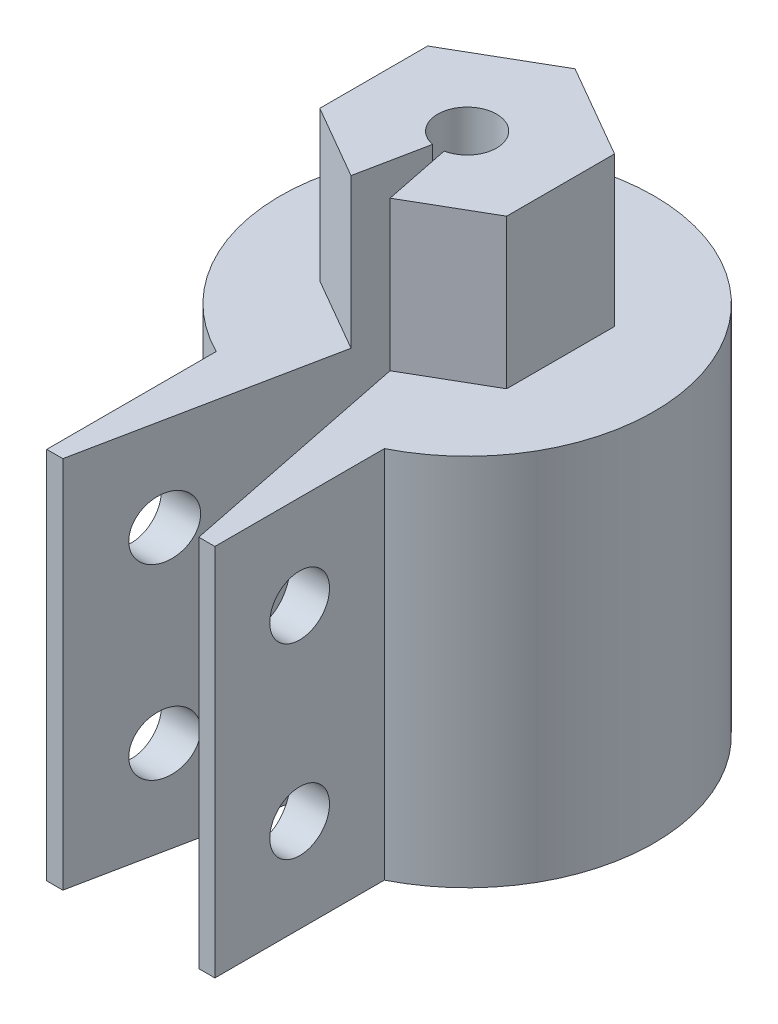
ISO-10303-21;
HEADER;
FILE_DESCRIPTION(('STEP AP214'),'2;1');
FILE_NAME('part.step','',(''),(''),'','','');
FILE_SCHEMA(('AUTOMOTIVE_DESIGN { 1 0 10303 214 1 1 1 1 }'));
ENDSEC;
DATA;
#1=APPLICATION_CONTEXT('core data for automotive mechanical design processes');
#2=APPLICATION_PROTOCOL_DEFINITION('international standard','automotive_design',2000,#1);
#3=PRODUCT_CONTEXT('',#1,'mechanical');
#4=PRODUCT('Part','Part','',(#3));
#5=PRODUCT_RELATED_PRODUCT_CATEGORY('part','',(#4));
#6=PRODUCT_DEFINITION_FORMATION('','',#4);
#7=PRODUCT_DEFINITION_CONTEXT('part definition',#1,'design');
#8=PRODUCT_DEFINITION('design','',#6,#7);
#9=PRODUCT_DEFINITION_SHAPE('','',#8);
#10=(LENGTH_UNIT() NAMED_UNIT(*) SI_UNIT(.MILLI.,.METRE.));
#11=(NAMED_UNIT(*) PLANE_ANGLE_UNIT() SI_UNIT($,.RADIAN.));
#12=(NAMED_UNIT(*) SI_UNIT($,.STERADIAN.) SOLID_ANGLE_UNIT());
#13=UNCERTAINTY_MEASURE_WITH_UNIT(LENGTH_MEASURE(1.E-05),#10,'distance_accuracy_value','');
#14=(GEOMETRIC_REPRESENTATION_CONTEXT(3) GLOBAL_UNCERTAINTY_ASSIGNED_CONTEXT((#13)) GLOBAL_UNIT_ASSIGNED_CONTEXT((#10,
#11,#12)) REPRESENTATION_CONTEXT('',''));
#15=CARTESIAN_POINT('',(0.,0.,0.));
#16=DIRECTION('',(0.,0.,1.));
#17=DIRECTION('',(1.,0.,0.));
#18=AXIS2_PLACEMENT_3D('',#15,#16,#17);
#19=CARTESIAN_POINT('',(-4.5,20.,18.));
#20=DIRECTION('',(0.,0.,-1.));
#21=DIRECTION('',(-1.,0.,0.));
#22=AXIS2_PLACEMENT_3D('',#19,#20,#21);
#23=PLANE('',#22);
#24=DIRECTION('',(1.,0.,0.));
#25=VECTOR('',#24,1.);
#26=CARTESIAN_POINT('',(-4.5,0.,18.));
#27=LINE('',#26,#25);
#28=CARTESIAN_POINT('',(-4.5,0.,18.));
#29=VERTEX_POINT('',#28);
#30=CARTESIAN_POINT('',(-3.63877850256524,0.,18.));
#31=VERTEX_POINT('',#30);
#32=EDGE_CURVE('E169',#29,#31,#27,.T.);
#33=ORIENTED_EDGE('',*,*,#32,.T.);
#34=DIRECTION('',(0.,1.,0.));
#35=VECTOR('',#34,1.);
#36=CARTESIAN_POINT('',(-3.63877850256524,0.,18.));
#37=LINE('',#36,#35);
#38=CARTESIAN_POINT('',(-3.63877850256524,20.,18.));
#39=VERTEX_POINT('',#38);
#40=EDGE_CURVE('E221',#31,#39,#37,.T.);
#41=ORIENTED_EDGE('',*,*,#40,.T.);
#42=DIRECTION('',(1.,0.,0.));
#43=VECTOR('',#42,1.);
#44=CARTESIAN_POINT('',(-4.5,20.,18.));
#45=LINE('',#44,#43);
#46=CARTESIAN_POINT('',(-4.5,20.,18.));
#47=VERTEX_POINT('',#46);
#48=EDGE_CURVE('E282',#47,#39,#45,.T.);
#49=ORIENTED_EDGE('',*,*,#48,.F.);
#50=DIRECTION('',(0.,-1.,0.));
#51=VECTOR('',#50,1.);
#52=CARTESIAN_POINT('',(-4.5,20.,18.));
#53=LINE('',#52,#51);
#54=EDGE_CURVE('E185',#47,#29,#53,.T.);
#55=ORIENTED_EDGE('',*,*,#54,.T.);
#56=EDGE_LOOP('',(#33,#41,#49,#55));
#57=FACE_BOUND('',#56,.T.);
#58=ADVANCED_FACE('F35',(#57),#23,.F.);
#59=CARTESIAN_POINT('',(0.,20.,0.));
#60=DIRECTION('',(0.,-1.,0.));
#61=DIRECTION('',(0.,0.,-1.));
#62=AXIS2_PLACEMENT_3D('',#59,#60,#61);
#63=CYLINDRICAL_SURFACE('',#62,10.);
#64=CARTESIAN_POINT('',(0.,0.,0.));
#65=DIRECTION('',(0.,1.,0.));
#66=DIRECTION('',(0.,0.,1.));
#67=AXIS2_PLACEMENT_3D('',#64,#65,#66);
#68=CIRCLE('',#67,10.);
#69=CARTESIAN_POINT('',(4.5,0.,8.93028554974588));
#70=VERTEX_POINT('',#69);
#71=CARTESIAN_POINT('',(-4.5,0.,8.93028554974588));
#72=VERTEX_POINT('',#71);
#73=EDGE_CURVE('E173',#70,#72,#68,.T.);
#74=ORIENTED_EDGE('',*,*,#73,.T.);
#75=DIRECTION('',(0.,-1.,0.));
#76=VECTOR('',#75,1.);
#77=CARTESIAN_POINT('',(-4.5,20.,8.93028554974588));
#78=LINE('',#77,#76);
#79=CARTESIAN_POINT('',(-4.5,20.,8.93028554974588));
#80=VERTEX_POINT('',#79);
#81=EDGE_CURVE('E44',#80,#72,#78,.T.);
#82=ORIENTED_EDGE('',*,*,#81,.F.);
#83=CARTESIAN_POINT('',(0.,20.,0.));
#84=DIRECTION('',(0.,1.,0.));
#85=DIRECTION('',(0.,0.,1.));
#86=AXIS2_PLACEMENT_3D('',#83,#84,#85);
#87=CIRCLE('',#86,10.);
#88=CARTESIAN_POINT('',(4.5,20.,8.93028554974588));
#89=VERTEX_POINT('',#88);
#90=EDGE_CURVE('E178',#89,#80,#87,.T.);
#91=ORIENTED_EDGE('',*,*,#90,.F.);
#92=DIRECTION('',(0.,-1.,0.));
#93=VECTOR('',#92,1.);
#94=CARTESIAN_POINT('',(4.5,20.,8.93028554974588));
#95=LINE('',#94,#93);
#96=EDGE_CURVE('E179',#89,#70,#95,.T.);
#97=ORIENTED_EDGE('',*,*,#96,.T.);
#98=EDGE_LOOP('',(#74,#82,#91,#97));
#99=FACE_BOUND('',#98,.T.);
#100=ADVANCED_FACE('F37',(#99),#63,.T.);
#101=CARTESIAN_POINT('',(-4.5,20.,8.93028554974588));
#102=DIRECTION('',(1.,0.,0.));
#103=DIRECTION('',(0.,0.,-1.));
#104=AXIS2_PLACEMENT_3D('',#101,#102,#103);
#105=PLANE('',#104);
#106=CARTESIAN_POINT('',(-4.5,15.,13.4651427748729));
#107=DIRECTION('',(-1.,0.,0.));
#108=DIRECTION('',(0.,0.,1.));
#109=AXIS2_PLACEMENT_3D('',#106,#107,#108);
#110=CIRCLE('',#109,1.6);
#111=CARTESIAN_POINT('',(-4.5,15.,15.0651427748729));
#112=VERTEX_POINT('',#111);
#113=EDGE_CURVE('E192',#112,#112,#110,.T.);
#114=ORIENTED_EDGE('',*,*,#113,.F.);
#115=EDGE_LOOP('',(#114));
#116=FACE_BOUND('',#115,.T.);
#117=CARTESIAN_POINT('',(-4.5,5.,13.4651427748729));
#118=DIRECTION('',(-1.,0.,0.));
#119=DIRECTION('',(0.,0.,1.));
#120=AXIS2_PLACEMENT_3D('',#117,#118,#119);
#121=CIRCLE('',#120,1.6);
#122=CARTESIAN_POINT('',(-4.5,5.,15.0651427748729));
#123=VERTEX_POINT('',#122);
#124=EDGE_CURVE('E199',#123,#123,#121,.T.);
#125=ORIENTED_EDGE('',*,*,#124,.F.);
#126=EDGE_LOOP('',(#125));
#127=FACE_BOUND('',#126,.T.);
#128=DIRECTION('',(0.,0.,1.));
#129=VECTOR('',#128,1.);
#130=CARTESIAN_POINT('',(-4.5,0.,8.93028554974588));
#131=LINE('',#130,#129);
#132=EDGE_CURVE('E170',#72,#29,#131,.T.);
#133=ORIENTED_EDGE('',*,*,#132,.T.);
#134=ORIENTED_EDGE('',*,*,#54,.F.);
#135=DIRECTION('',(0.,0.,1.));
#136=VECTOR('',#135,1.);
#137=CARTESIAN_POINT('',(-4.5,20.,8.93028554974588));
#138=LINE('',#137,#136);
#139=EDGE_CURVE('E280',#80,#47,#138,.T.);
#140=ORIENTED_EDGE('',*,*,#139,.F.);
#141=ORIENTED_EDGE('',*,*,#81,.T.);
#142=EDGE_LOOP('',(#133,#134,#140,#141));
#143=FACE_BOUND('',#142,.T.);
#144=ADVANCED_FACE('F293',(#116,#127,#143),#105,.F.);
#145=CARTESIAN_POINT('',(3.63877850256524,20.,18.));
#146=VERTEX_POINT('',#145);
#147=CARTESIAN_POINT('',(4.5,20.,18.));
#148=VERTEX_POINT('',#147);
#149=EDGE_CURVE('E162',#146,#148,#45,.T.);
#150=ORIENTED_EDGE('',*,*,#149,.F.);
#151=DIRECTION('',(0.,1.,0.));
#152=VECTOR('',#151,1.);
#153=CARTESIAN_POINT('',(3.63877850256524,0.,18.));
#154=LINE('',#153,#152);
#155=CARTESIAN_POINT('',(3.63877850256524,0.,18.));
#156=VERTEX_POINT('',#155);
#157=EDGE_CURVE('E145',#156,#146,#154,.T.);
#158=ORIENTED_EDGE('',*,*,#157,.F.);
#159=CARTESIAN_POINT('',(4.5,0.,18.));
#160=VERTEX_POINT('',#159);
#161=EDGE_CURVE('E160',#156,#160,#27,.T.);
#162=ORIENTED_EDGE('',*,*,#161,.T.);
#163=DIRECTION('',(0.,-1.,0.));
#164=VECTOR('',#163,1.);
#165=CARTESIAN_POINT('',(4.5,20.,18.));
#166=LINE('',#165,#164);
#167=EDGE_CURVE('E182',#148,#160,#166,.T.);
#168=ORIENTED_EDGE('',*,*,#167,.F.);
#169=EDGE_LOOP('',(#150,#158,#162,#168));
#170=FACE_BOUND('',#169,.T.);
#171=ADVANCED_FACE('F158',(#170),#23,.F.);
#172=CARTESIAN_POINT('',(4.5,20.,8.93028554974588));
#173=DIRECTION('',(-1.,0.,0.));
#174=DIRECTION('',(0.,0.,1.));
#175=AXIS2_PLACEMENT_3D('',#172,#173,#174);
#176=PLANE('',#175);
#177=CARTESIAN_POINT('',(4.5,15.,13.4651427748729));
#178=DIRECTION('',(-1.,0.,0.));
#179=DIRECTION('',(0.,0.,1.));
#180=AXIS2_PLACEMENT_3D('',#177,#178,#179);
#181=CIRCLE('',#180,1.6);
#182=CARTESIAN_POINT('',(4.5,15.,15.0651427748729));
#183=VERTEX_POINT('',#182);
#184=EDGE_CURVE('E211',#183,#183,#181,.T.);
#185=ORIENTED_EDGE('',*,*,#184,.T.);
#186=EDGE_LOOP('',(#185));
#187=FACE_BOUND('',#186,.T.);
#188=CARTESIAN_POINT('',(4.5,5.,13.4651427748729));
#189=DIRECTION('',(-1.,0.,0.));
#190=DIRECTION('',(0.,0.,1.));
#191=AXIS2_PLACEMENT_3D('',#188,#189,#190);
#192=CIRCLE('',#191,1.6);
#193=CARTESIAN_POINT('',(4.5,5.,15.0651427748729));
#194=VERTEX_POINT('',#193);
#195=EDGE_CURVE('E196',#194,#194,#192,.T.);
#196=ORIENTED_EDGE('',*,*,#195,.T.);
#197=EDGE_LOOP('',(#196));
#198=FACE_BOUND('',#197,.T.);
#199=DIRECTION('',(0.,0.,-1.));
#200=VECTOR('',#199,1.);
#201=CARTESIAN_POINT('',(4.5,0.,8.93028554974588));
#202=LINE('',#201,#200);
#203=EDGE_CURVE('E168',#160,#70,#202,.T.);
#204=ORIENTED_EDGE('',*,*,#203,.T.);
#205=ORIENTED_EDGE('',*,*,#96,.F.);
#206=DIRECTION('',(0.,0.,-1.));
#207=VECTOR('',#206,1.);
#208=CARTESIAN_POINT('',(4.5,20.,8.93028554974588));
#209=LINE('',#208,#207);
#210=EDGE_CURVE('E183',#148,#89,#209,.T.);
#211=ORIENTED_EDGE('',*,*,#210,.F.);
#212=ORIENTED_EDGE('',*,*,#167,.T.);
#213=EDGE_LOOP('',(#204,#205,#211,#212));
#214=FACE_BOUND('',#213,.T.);
#215=ADVANCED_FACE('F299',(#187,#198,#214),#176,.F.);
#216=CARTESIAN_POINT('',(0.,20.,0.));
#217=DIRECTION('',(0.,1.,0.));
#218=DIRECTION('',(0.,0.,1.));
#219=AXIS2_PLACEMENT_3D('',#216,#217,#218);
#220=PLANE('',#219);
#221=DIRECTION('',(-0.198146143199398,0.,0.980172487848544));
#222=VECTOR('',#221,1.);
#223=CARTESIAN_POINT('',(0.,20.,0.));
#224=LINE('',#223,#222);
#225=CARTESIAN_POINT('',(-1.04515469461128,20.,5.17008234761764));
#226=VERTEX_POINT('',#225);
#227=EDGE_CURVE('E233',#226,#39,#224,.T.);
#228=ORIENTED_EDGE('',*,*,#227,.F.);
#229=DIRECTION('',(0.866025403784438,0.,0.5));
#230=VECTOR('',#229,1.);
#231=CARTESIAN_POINT('',(-5.,20.,2.88675134594813));
#232=LINE('',#231,#230);
#233=CARTESIAN_POINT('',(-5.,20.,2.88675134594813));
#234=VERTEX_POINT('',#233);
#235=EDGE_CURVE('E258',#234,#226,#232,.T.);
#236=ORIENTED_EDGE('',*,*,#235,.F.);
#237=DIRECTION('',(0.,0.,1.));
#238=VECTOR('',#237,1.);
#239=CARTESIAN_POINT('',(-5.,20.,-2.88675134594813));
#240=LINE('',#239,#238);
#241=CARTESIAN_POINT('',(-5.,20.,-2.88675134594813));
#242=VERTEX_POINT('',#241);
#243=EDGE_CURVE('E255',#242,#234,#240,.T.);
#244=ORIENTED_EDGE('',*,*,#243,.F.);
#245=DIRECTION('',(-0.866025403784439,0.,0.5));
#246=VECTOR('',#245,1.);
#247=CARTESIAN_POINT('',(0.,20.,-5.77350269189626));
#248=LINE('',#247,#246);
#249=CARTESIAN_POINT('',(0.,20.,-5.77350269189626));
#250=VERTEX_POINT('',#249);
#251=EDGE_CURVE('E252',#250,#242,#248,.T.);
#252=ORIENTED_EDGE('',*,*,#251,.F.);
#253=DIRECTION('',(-0.866025403784439,0.,-0.5));
#254=VECTOR('',#253,1.);
#255=CARTESIAN_POINT('',(5.,20.,-2.88675134594813));
#256=LINE('',#255,#254);
#257=CARTESIAN_POINT('',(5.,20.,-2.88675134594813));
#258=VERTEX_POINT('',#257);
#259=EDGE_CURVE('E59',#258,#250,#256,.T.);
#260=ORIENTED_EDGE('',*,*,#259,.F.);
#261=DIRECTION('',(0.,0.,-1.));
#262=VECTOR('',#261,1.);
#263=CARTESIAN_POINT('',(5.,20.,2.88675134594813));
#264=LINE('',#263,#262);
#265=CARTESIAN_POINT('',(5.,20.,2.88675134594813));
#266=VERTEX_POINT('',#265);
#267=EDGE_CURVE('E239',#266,#258,#264,.T.);
#268=ORIENTED_EDGE('',*,*,#267,.F.);
#269=DIRECTION('',(0.866025403784439,0.,-0.5));
#270=VECTOR('',#269,1.);
#271=CARTESIAN_POINT('',(0.,20.,5.77350269189626));
#272=LINE('',#271,#270);
#273=CARTESIAN_POINT('',(1.04515469461128,20.,5.17008234761763));
#274=VERTEX_POINT('',#273);
#275=EDGE_CURVE('E261',#274,#266,#272,.T.);
#276=ORIENTED_EDGE('',*,*,#275,.F.);
#277=DIRECTION('',(-0.198146143199398,0.,-0.980172487848544));
#278=VECTOR('',#277,1.);
#279=CARTESIAN_POINT('',(0.,20.,0.));
#280=LINE('',#279,#278);
#281=EDGE_CURVE('E228',#146,#274,#280,.T.);
#282=ORIENTED_EDGE('',*,*,#281,.F.);
#283=ORIENTED_EDGE('',*,*,#149,.T.);
#284=ORIENTED_EDGE('',*,*,#210,.T.);
#285=ORIENTED_EDGE('',*,*,#90,.T.);
#286=ORIENTED_EDGE('',*,*,#139,.T.);
#287=ORIENTED_EDGE('',*,*,#48,.T.);
#288=EDGE_LOOP('',(#228,#236,#244,#252,#260,#268,#276,#282,#283,#284,#285,#286,#287));
#289=FACE_BOUND('',#288,.T.);
#290=ADVANCED_FACE('F296',(#289),#220,.T.);
#291=CARTESIAN_POINT('',(0.,0.,0.));
#292=DIRECTION('',(0.,1.,0.));
#293=DIRECTION('',(0.,0.,1.));
#294=AXIS2_PLACEMENT_3D('',#291,#292,#293);
#295=PLANE('',#294);
#296=CARTESIAN_POINT('',(0.,0.,0.));
#297=DIRECTION('',(0.,1.,0.));
#298=DIRECTION('',(0.,0.,1.));
#299=AXIS2_PLACEMENT_3D('',#296,#297,#298);
#300=CIRCLE('',#299,1.575);
#301=CARTESIAN_POINT('',(0.312080175539051,0.,1.54377166836146));
#302=VERTEX_POINT('',#301);
#303=CARTESIAN_POINT('',(-0.312080175539051,0.,1.54377166836146));
#304=VERTEX_POINT('',#303);
#305=EDGE_CURVE('E153',#302,#304,#300,.T.);
#306=ORIENTED_EDGE('',*,*,#305,.T.);
#307=DIRECTION('',(-0.198146143199398,0.,0.980172487848544));
#308=VECTOR('',#307,1.);
#309=CARTESIAN_POINT('',(-3.63877850256524,0.,18.));
#310=LINE('',#309,#308);
#311=EDGE_CURVE('E163',#304,#31,#310,.T.);
#312=ORIENTED_EDGE('',*,*,#311,.T.);
#313=ORIENTED_EDGE('',*,*,#32,.F.);
#314=ORIENTED_EDGE('',*,*,#132,.F.);
#315=ORIENTED_EDGE('',*,*,#73,.F.);
#316=ORIENTED_EDGE('',*,*,#203,.F.);
#317=ORIENTED_EDGE('',*,*,#161,.F.);
#318=DIRECTION('',(-0.198146143199398,0.,-0.980172487848544));
#319=VECTOR('',#318,1.);
#320=CARTESIAN_POINT('',(0.312080175539051,0.,1.54377166836146));
#321=LINE('',#320,#319);
#322=EDGE_CURVE('E142',#156,#302,#321,.T.);
#323=ORIENTED_EDGE('',*,*,#322,.T.);
#324=EDGE_LOOP('',(#306,#312,#313,#314,#315,#316,#317,#323));
#325=FACE_BOUND('',#324,.T.);
#326=ADVANCED_FACE('F166',(#325),#295,.F.);
#327=CARTESIAN_POINT('',(5.,28.,-2.88675134594813));
#328=DIRECTION('',(-0.5,0.,0.866025403784439));
#329=DIRECTION('',(0.866025403784439,0.,0.5));
#330=AXIS2_PLACEMENT_3D('',#327,#328,#329);
#331=PLANE('',#330);
#332=ORIENTED_EDGE('',*,*,#259,.T.);
#333=DIRECTION('',(0.,-1.,0.));
#334=VECTOR('',#333,1.);
#335=CARTESIAN_POINT('',(0.,28.,-5.77350269189626));
#336=LINE('',#335,#334);
#337=CARTESIAN_POINT('',(0.,28.,-5.77350269189626));
#338=VERTEX_POINT('',#337);
#339=EDGE_CURVE('E275',#338,#250,#336,.T.);
#340=ORIENTED_EDGE('',*,*,#339,.F.);
#341=DIRECTION('',(-0.866025403784439,0.,-0.5));
#342=VECTOR('',#341,1.);
#343=CARTESIAN_POINT('',(5.,28.,-2.88675134594813));
#344=LINE('',#343,#342);
#345=CARTESIAN_POINT('',(5.,28.,-2.88675134594813));
#346=VERTEX_POINT('',#345);
#347=EDGE_CURVE('E235',#346,#338,#344,.T.);
#348=ORIENTED_EDGE('',*,*,#347,.F.);
#349=DIRECTION('',(0.,-1.,0.));
#350=VECTOR('',#349,1.);
#351=CARTESIAN_POINT('',(5.,28.,-2.88675134594813));
#352=LINE('',#351,#350);
#353=EDGE_CURVE('E250',#346,#258,#352,.T.);
#354=ORIENTED_EDGE('',*,*,#353,.T.);
#355=EDGE_LOOP('',(#332,#340,#348,#354));
#356=FACE_BOUND('',#355,.T.);
#357=ADVANCED_FACE('F353',(#356),#331,.F.);
#358=CARTESIAN_POINT('',(0.,28.,-5.77350269189626));
#359=DIRECTION('',(0.5,0.,0.866025403784439));
#360=DIRECTION('',(0.866025403784439,0.,-0.5));
#361=AXIS2_PLACEMENT_3D('',#358,#359,#360);
#362=PLANE('',#361);
#363=ORIENTED_EDGE('',*,*,#251,.T.);
#364=DIRECTION('',(0.,-1.,0.));
#365=VECTOR('',#364,1.);
#366=CARTESIAN_POINT('',(-5.,28.,-2.88675134594813));
#367=LINE('',#366,#365);
#368=CARTESIAN_POINT('',(-5.,28.,-2.88675134594813));
#369=VERTEX_POINT('',#368);
#370=EDGE_CURVE('E272',#369,#242,#367,.T.);
#371=ORIENTED_EDGE('',*,*,#370,.F.);
#372=DIRECTION('',(-0.866025403784439,0.,0.5));
#373=VECTOR('',#372,1.);
#374=CARTESIAN_POINT('',(0.,28.,-5.77350269189626));
#375=LINE('',#374,#373);
#376=EDGE_CURVE('E238',#338,#369,#375,.T.);
#377=ORIENTED_EDGE('',*,*,#376,.F.);
#378=ORIENTED_EDGE('',*,*,#339,.T.);
#379=EDGE_LOOP('',(#363,#371,#377,#378));
#380=FACE_BOUND('',#379,.T.);
#381=ADVANCED_FACE('F349',(#380),#362,.F.);
#382=CARTESIAN_POINT('',(-5.,28.,-2.88675134594813));
#383=DIRECTION('',(1.,0.,0.));
#384=DIRECTION('',(0.,0.,-1.));
#385=AXIS2_PLACEMENT_3D('',#382,#383,#384);
#386=PLANE('',#385);
#387=ORIENTED_EDGE('',*,*,#243,.T.);
#388=DIRECTION('',(0.,-1.,0.));
#389=VECTOR('',#388,1.);
#390=CARTESIAN_POINT('',(-5.,28.,2.88675134594813));
#391=LINE('',#390,#389);
#392=CARTESIAN_POINT('',(-5.,28.,2.88675134594813));
#393=VERTEX_POINT('',#392);
#394=EDGE_CURVE('E269',#393,#234,#391,.T.);
#395=ORIENTED_EDGE('',*,*,#394,.F.);
#396=DIRECTION('',(0.,0.,1.));
#397=VECTOR('',#396,1.);
#398=CARTESIAN_POINT('',(-5.,28.,-2.88675134594813));
#399=LINE('',#398,#397);
#400=EDGE_CURVE('E241',#369,#393,#399,.T.);
#401=ORIENTED_EDGE('',*,*,#400,.F.);
#402=ORIENTED_EDGE('',*,*,#370,.T.);
#403=EDGE_LOOP('',(#387,#395,#401,#402));
#404=FACE_BOUND('',#403,.T.);
#405=ADVANCED_FACE('F346',(#404),#386,.F.);
#406=CARTESIAN_POINT('',(-5.,28.,2.88675134594813));
#407=DIRECTION('',(0.5,0.,-0.866025403784438));
#408=DIRECTION('',(-0.866025403784438,0.,-0.5));
#409=AXIS2_PLACEMENT_3D('',#406,#407,#408);
#410=PLANE('',#409);
#411=ORIENTED_EDGE('',*,*,#235,.T.);
#412=DIRECTION('',(0.,1.,0.));
#413=VECTOR('',#412,1.);
#414=CARTESIAN_POINT('',(-1.04515469461128,28.,5.17008234761764));
#415=LINE('',#414,#413);
#416=CARTESIAN_POINT('',(-1.04515469461128,28.,5.17008234761763));
#417=VERTEX_POINT('',#416);
#418=EDGE_CURVE('E230',#226,#417,#415,.T.);
#419=ORIENTED_EDGE('',*,*,#418,.T.);
#420=DIRECTION('',(0.866025403784438,0.,0.5));
#421=VECTOR('',#420,1.);
#422=CARTESIAN_POINT('',(-5.,28.,2.88675134594813));
#423=LINE('',#422,#421);
#424=EDGE_CURVE('E243',#393,#417,#423,.T.);
#425=ORIENTED_EDGE('',*,*,#424,.F.);
#426=ORIENTED_EDGE('',*,*,#394,.T.);
#427=EDGE_LOOP('',(#411,#419,#425,#426));
#428=FACE_BOUND('',#427,.T.);
#429=ADVANCED_FACE('F341',(#428),#410,.F.);
#430=CARTESIAN_POINT('',(0.,28.,5.77350269189626));
#431=DIRECTION('',(-0.5,0.,-0.866025403784439));
#432=DIRECTION('',(-0.866025403784439,0.,0.5));
#433=AXIS2_PLACEMENT_3D('',#430,#431,#432);
#434=PLANE('',#433);
#435=DIRECTION('',(0.866025403784439,0.,-0.5));
#436=VECTOR('',#435,1.);
#437=CARTESIAN_POINT('',(0.,28.,5.77350269189626));
#438=LINE('',#437,#436);
#439=CARTESIAN_POINT('',(1.04515469461128,28.,5.17008234761763));
#440=VERTEX_POINT('',#439);
#441=CARTESIAN_POINT('',(5.,28.,2.88675134594813));
#442=VERTEX_POINT('',#441);
#443=EDGE_CURVE('E246',#440,#442,#438,.T.);
#444=ORIENTED_EDGE('',*,*,#443,.F.);
#445=DIRECTION('',(0.,-1.,0.));
#446=VECTOR('',#445,1.);
#447=CARTESIAN_POINT('',(1.04515469461128,28.,5.17008234761763));
#448=LINE('',#447,#446);
#449=EDGE_CURVE('E51',#440,#274,#448,.T.);
#450=ORIENTED_EDGE('',*,*,#449,.T.);
#451=ORIENTED_EDGE('',*,*,#275,.T.);
#452=DIRECTION('',(0.,-1.,0.));
#453=VECTOR('',#452,1.);
#454=CARTESIAN_POINT('',(5.,28.,2.88675134594813));
#455=LINE('',#454,#453);
#456=EDGE_CURVE('E266',#442,#266,#455,.T.);
#457=ORIENTED_EDGE('',*,*,#456,.F.);
#458=EDGE_LOOP('',(#444,#450,#451,#457));
#459=FACE_BOUND('',#458,.T.);
#460=ADVANCED_FACE('F362',(#459),#434,.F.);
#461=CARTESIAN_POINT('',(5.,28.,2.88675134594813));
#462=DIRECTION('',(-1.,0.,0.));
#463=DIRECTION('',(0.,0.,1.));
#464=AXIS2_PLACEMENT_3D('',#461,#462,#463);
#465=PLANE('',#464);
#466=ORIENTED_EDGE('',*,*,#267,.T.);
#467=ORIENTED_EDGE('',*,*,#353,.F.);
#468=DIRECTION('',(0.,0.,-1.));
#469=VECTOR('',#468,1.);
#470=CARTESIAN_POINT('',(5.,28.,2.88675134594813));
#471=LINE('',#470,#469);
#472=EDGE_CURVE('E248',#442,#346,#471,.T.);
#473=ORIENTED_EDGE('',*,*,#472,.F.);
#474=ORIENTED_EDGE('',*,*,#456,.T.);
#475=EDGE_LOOP('',(#466,#467,#473,#474));
#476=FACE_BOUND('',#475,.T.);
#477=ADVANCED_FACE('F357',(#476),#465,.F.);
#478=CARTESIAN_POINT('',(0.,28.,0.));
#479=DIRECTION('',(0.,1.,0.));
#480=DIRECTION('',(0.,0.,1.));
#481=AXIS2_PLACEMENT_3D('',#478,#479,#480);
#482=PLANE('',#481);
#483=DIRECTION('',(-0.198146143199398,0.,0.980172487848544));
#484=VECTOR('',#483,1.);
#485=CARTESIAN_POINT('',(-3.63877850256524,28.,18.));
#486=LINE('',#485,#484);
#487=CARTESIAN_POINT('',(-0.312080175539051,28.,1.54377166836146));
#488=VERTEX_POINT('',#487);
#489=EDGE_CURVE('E154',#488,#417,#486,.T.);
#490=ORIENTED_EDGE('',*,*,#489,.F.);
#491=CARTESIAN_POINT('',(0.,28.,0.));
#492=DIRECTION('',(0.,1.,0.));
#493=DIRECTION('',(0.,0.,1.));
#494=AXIS2_PLACEMENT_3D('',#491,#492,#493);
#495=CIRCLE('',#494,1.575);
#496=CARTESIAN_POINT('',(0.312080175539051,28.,1.54377166836146));
#497=VERTEX_POINT('',#496);
#498=EDGE_CURVE('E213',#497,#488,#495,.T.);
#499=ORIENTED_EDGE('',*,*,#498,.F.);
#500=DIRECTION('',(-0.198146143199398,0.,-0.980172487848544));
#501=VECTOR('',#500,1.);
#502=CARTESIAN_POINT('',(0.,28.,0.));
#503=LINE('',#502,#501);
#504=EDGE_CURVE('E11',#440,#497,#503,.T.);
#505=ORIENTED_EDGE('',*,*,#504,.F.);
#506=ORIENTED_EDGE('',*,*,#443,.T.);
#507=ORIENTED_EDGE('',*,*,#472,.T.);
#508=ORIENTED_EDGE('',*,*,#347,.T.);
#509=ORIENTED_EDGE('',*,*,#376,.T.);
#510=ORIENTED_EDGE('',*,*,#400,.T.);
#511=ORIENTED_EDGE('',*,*,#424,.T.);
#512=EDGE_LOOP('',(#490,#499,#505,#506,#507,#508,#509,#510,#511));
#513=FACE_BOUND('',#512,.T.);
#514=ADVANCED_FACE('F336',(#513),#482,.T.);
#515=CARTESIAN_POINT('',(-3.63877850256524,0.,18.));
#516=DIRECTION('',(-0.980172487848544,0.,-0.198146143199398));
#517=DIRECTION('',(-0.198146143199398,0.,0.980172487848544));
#518=AXIS2_PLACEMENT_3D('',#515,#516,#517);
#519=PLANE('',#518);
#520=CARTESIAN_POINT('',(-2.72203733684329,15.,13.4651427748729));
#521=DIRECTION('',(-0.980172487848544,0.,-0.198146143199398));
#522=DIRECTION('',(-0.198146143199398,0.,0.980172487848544));
#523=AXIS2_PLACEMENT_3D('',#520,#521,#522);
#524=ELLIPSE('',#523,1.63236575177902,1.6);
#525=CARTESIAN_POINT('',(-3.04548431484909,15.,15.0651427748729));
#526=VERTEX_POINT('',#525);
#527=EDGE_CURVE('E208',#526,#526,#524,.T.);
#528=ORIENTED_EDGE('',*,*,#527,.T.);
#529=EDGE_LOOP('',(#528));
#530=FACE_BOUND('',#529,.T.);
#531=CARTESIAN_POINT('',(-2.72203733684329,5.,13.4651427748729));
#532=DIRECTION('',(-0.980172487848544,0.,-0.198146143199398));
#533=DIRECTION('',(-0.198146143199398,0.,0.980172487848544));
#534=AXIS2_PLACEMENT_3D('',#531,#532,#533);
#535=ELLIPSE('',#534,1.63236575177902,1.6);
#536=CARTESIAN_POINT('',(-3.04548431484909,5.,15.0651427748729));
#537=VERTEX_POINT('',#536);
#538=EDGE_CURVE('E191',#537,#537,#535,.T.);
#539=ORIENTED_EDGE('',*,*,#538,.T.);
#540=EDGE_LOOP('',(#539));
#541=FACE_BOUND('',#540,.T.);
#542=ORIENTED_EDGE('',*,*,#227,.T.);
#543=ORIENTED_EDGE('',*,*,#40,.F.);
#544=ORIENTED_EDGE('',*,*,#311,.F.);
#545=DIRECTION('',(0.,1.,0.));
#546=VECTOR('',#545,1.);
#547=CARTESIAN_POINT('',(-0.312080175539051,0.,1.54377166836146));
#548=LINE('',#547,#546);
#549=EDGE_CURVE('E224',#304,#488,#548,.T.);
#550=ORIENTED_EDGE('',*,*,#549,.T.);
#551=ORIENTED_EDGE('',*,*,#489,.T.);
#552=ORIENTED_EDGE('',*,*,#418,.F.);
#553=EDGE_LOOP('',(#542,#543,#544,#550,#551,#552));
#554=FACE_BOUND('',#553,.T.);
#555=ADVANCED_FACE('F332',(#530,#541,#554),#519,.F.);
#556=CARTESIAN_POINT('',(0.,0.,0.));
#557=DIRECTION('',(0.,1.,0.));
#558=DIRECTION('',(0.,0.,1.));
#559=AXIS2_PLACEMENT_3D('',#556,#557,#558);
#560=CYLINDRICAL_SURFACE('',#559,1.575);
#561=ORIENTED_EDGE('',*,*,#498,.T.);
#562=ORIENTED_EDGE('',*,*,#549,.F.);
#563=ORIENTED_EDGE('',*,*,#305,.F.);
#564=DIRECTION('',(0.,1.,0.));
#565=VECTOR('',#564,1.);
#566=CARTESIAN_POINT('',(0.312080175539051,0.,1.54377166836146));
#567=LINE('',#566,#565);
#568=EDGE_CURVE('E148',#302,#497,#567,.T.);
#569=ORIENTED_EDGE('',*,*,#568,.T.);
#570=EDGE_LOOP('',(#561,#562,#563,#569));
#571=FACE_BOUND('',#570,.T.);
#572=ADVANCED_FACE('F335',(#571),#560,.F.);
#573=CARTESIAN_POINT('',(0.312080175539051,0.,1.54377166836146));
#574=DIRECTION('',(0.980172487848544,0.,-0.198146143199398));
#575=DIRECTION('',(-0.198146143199398,0.,-0.980172487848544));
#576=AXIS2_PLACEMENT_3D('',#573,#574,#575);
#577=PLANE('',#576);
#578=CARTESIAN_POINT('',(2.72203733684329,15.,13.4651427748729));
#579=DIRECTION('',(0.980172487848544,0.,-0.198146143199398));
#580=DIRECTION('',(-0.198146143199398,0.,-0.980172487848544));
#581=AXIS2_PLACEMENT_3D('',#578,#579,#580);
#582=ELLIPSE('',#581,1.63236575177902,1.6);
#583=CARTESIAN_POINT('',(2.39859035883749,15.,11.8651427748729));
#584=VERTEX_POINT('',#583);
#585=EDGE_CURVE('E39',#584,#584,#582,.T.);
#586=ORIENTED_EDGE('',*,*,#585,.T.);
#587=EDGE_LOOP('',(#586));
#588=FACE_BOUND('',#587,.T.);
#589=CARTESIAN_POINT('',(2.72203733684329,5.,13.4651427748729));
#590=DIRECTION('',(0.980172487848544,0.,-0.198146143199398));
#591=DIRECTION('',(-0.198146143199398,0.,-0.980172487848544));
#592=AXIS2_PLACEMENT_3D('',#589,#590,#591);
#593=ELLIPSE('',#592,1.63236575177902,1.6);
#594=CARTESIAN_POINT('',(2.39859035883749,5.,11.8651427748729));
#595=VERTEX_POINT('',#594);
#596=EDGE_CURVE('E189',#595,#595,#593,.T.);
#597=ORIENTED_EDGE('',*,*,#596,.T.);
#598=EDGE_LOOP('',(#597));
#599=FACE_BOUND('',#598,.T.);
#600=ORIENTED_EDGE('',*,*,#281,.T.);
#601=ORIENTED_EDGE('',*,*,#449,.F.);
#602=ORIENTED_EDGE('',*,*,#504,.T.);
#603=ORIENTED_EDGE('',*,*,#568,.F.);
#604=ORIENTED_EDGE('',*,*,#322,.F.);
#605=ORIENTED_EDGE('',*,*,#157,.T.);
#606=EDGE_LOOP('',(#600,#601,#602,#603,#604,#605));
#607=FACE_BOUND('',#606,.T.);
#608=ADVANCED_FACE('F144',(#588,#599,#607),#577,.F.);
#609=CARTESIAN_POINT('',(10.,5.,13.4651427748729));
#610=DIRECTION('',(-1.,0.,0.));
#611=DIRECTION('',(0.,0.,1.));
#612=AXIS2_PLACEMENT_3D('',#609,#610,#611);
#613=CYLINDRICAL_SURFACE('',#612,1.6);
#614=ORIENTED_EDGE('',*,*,#596,.F.);
#615=EDGE_LOOP('',(#614));
#616=FACE_BOUND('',#615,.T.);
#617=ORIENTED_EDGE('',*,*,#195,.F.);
#618=EDGE_LOOP('',(#617));
#619=FACE_BOUND('',#618,.T.);
#620=ADVANCED_FACE('F329',(#616,#619),#613,.F.);
#621=CARTESIAN_POINT('',(10.,15.,13.4651427748729));
#622=DIRECTION('',(-1.,0.,0.));
#623=DIRECTION('',(0.,0.,1.));
#624=AXIS2_PLACEMENT_3D('',#621,#622,#623);
#625=CYLINDRICAL_SURFACE('',#624,1.6);
#626=ORIENTED_EDGE('',*,*,#585,.F.);
#627=EDGE_LOOP('',(#626));
#628=FACE_BOUND('',#627,.T.);
#629=ORIENTED_EDGE('',*,*,#184,.F.);
#630=EDGE_LOOP('',(#629));
#631=FACE_BOUND('',#630,.T.);
#632=ADVANCED_FACE('F327',(#628,#631),#625,.F.);
#633=ORIENTED_EDGE('',*,*,#124,.T.);
#634=EDGE_LOOP('',(#633));
#635=FACE_BOUND('',#634,.T.);
#636=ORIENTED_EDGE('',*,*,#538,.F.);
#637=EDGE_LOOP('',(#636));
#638=FACE_BOUND('',#637,.T.);
#639=ADVANCED_FACE('F323',(#635,#638),#613,.F.);
#640=ORIENTED_EDGE('',*,*,#113,.T.);
#641=EDGE_LOOP('',(#640));
#642=FACE_BOUND('',#641,.T.);
#643=ORIENTED_EDGE('',*,*,#527,.F.);
#644=EDGE_LOOP('',(#643));
#645=FACE_BOUND('',#644,.T.);
#646=ADVANCED_FACE('F326',(#642,#645),#625,.F.);
#647=CLOSED_SHELL('',(#58,#100,#144,#171,#215,#290,#326,#357,#381,#405,#429,#460,#477,#514,#555,
#572,#608,#620,#632,#639,#646));
#648=MANIFOLD_SOLID_BREP('B2',#647);
#649=ADVANCED_BREP_SHAPE_REPRESENTATION('',(#18,#648),#14);
#650=SHAPE_DEFINITION_REPRESENTATION(#9,#649);
ENDSEC;
END-ISO-10303-21;
